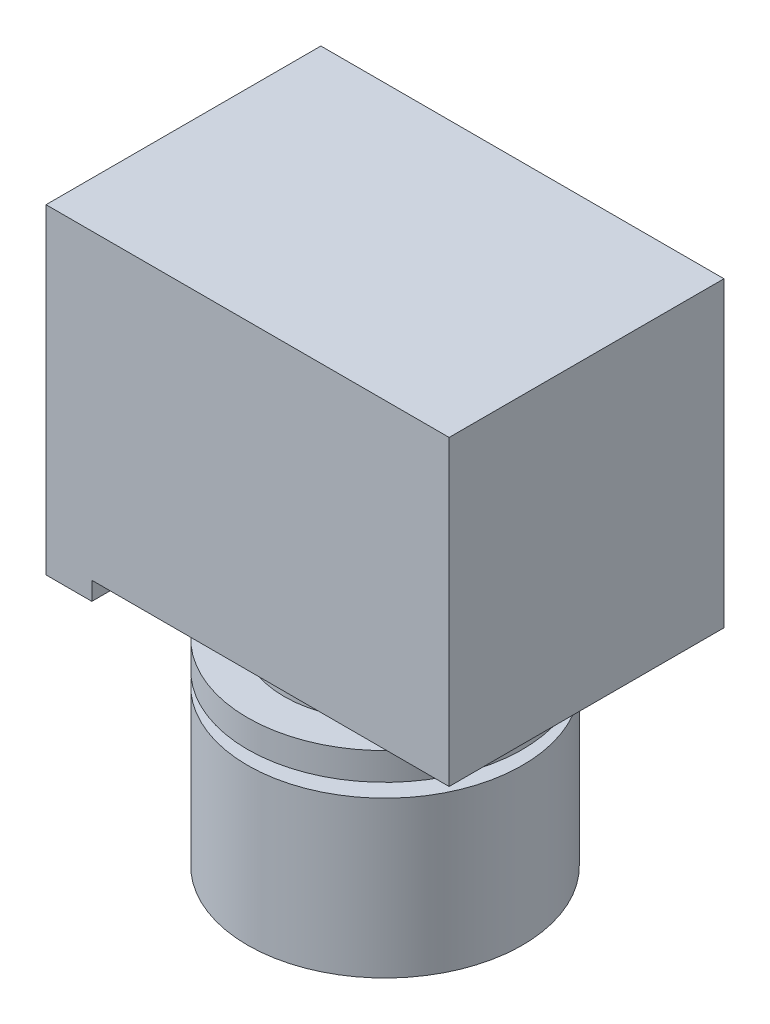
ISO-10303-21;
HEADER;
FILE_DESCRIPTION(('STEP AP214'),'2;1');
FILE_NAME('part.step','',(''),(''),'','','');
FILE_SCHEMA(('AUTOMOTIVE_DESIGN { 1 0 10303 214 1 1 1 1 }'));
ENDSEC;
DATA;
#1=APPLICATION_CONTEXT('core data for automotive mechanical design processes');
#2=APPLICATION_PROTOCOL_DEFINITION('international standard','automotive_design',2000,#1);
#3=PRODUCT_CONTEXT('',#1,'mechanical');
#4=PRODUCT('Part','Part','',(#3));
#5=PRODUCT_RELATED_PRODUCT_CATEGORY('part','',(#4));
#6=PRODUCT_DEFINITION_FORMATION('','',#4);
#7=PRODUCT_DEFINITION_CONTEXT('part definition',#1,'design');
#8=PRODUCT_DEFINITION('design','',#6,#7);
#9=PRODUCT_DEFINITION_SHAPE('','',#8);
#10=(LENGTH_UNIT() NAMED_UNIT(*) SI_UNIT(.MILLI.,.METRE.));
#11=(NAMED_UNIT(*) PLANE_ANGLE_UNIT() SI_UNIT($,.RADIAN.));
#12=(NAMED_UNIT(*) SI_UNIT($,.STERADIAN.) SOLID_ANGLE_UNIT());
#13=UNCERTAINTY_MEASURE_WITH_UNIT(LENGTH_MEASURE(1.E-05),#10,'distance_accuracy_value','');
#14=(GEOMETRIC_REPRESENTATION_CONTEXT(3) GLOBAL_UNCERTAINTY_ASSIGNED_CONTEXT((#13)) GLOBAL_UNIT_ASSIGNED_CONTEXT((#10,
#11,#12)) REPRESENTATION_CONTEXT('',''));
#15=CARTESIAN_POINT('',(0.,0.,0.));
#16=DIRECTION('',(0.,0.,1.));
#17=DIRECTION('',(1.,0.,0.));
#18=AXIS2_PLACEMENT_3D('',#15,#16,#17);
#19=CARTESIAN_POINT('',(-22.,26.,15.));
#20=DIRECTION('',(0.,1.,0.));
#21=DIRECTION('',(0.,0.,1.));
#22=AXIS2_PLACEMENT_3D('',#19,#20,#21);
#23=PLANE('',#22);
#24=CARTESIAN_POINT('',(0.,26.,0.));
#25=DIRECTION('',(0.,1.,0.));
#26=DIRECTION('',(0.,0.,1.));
#27=AXIS2_PLACEMENT_3D('',#24,#25,#26);
#28=CIRCLE('',#27,11.);
#29=CARTESIAN_POINT('',(0.,26.,11.));
#30=VERTEX_POINT('',#29);
#31=EDGE_CURVE('E123',#30,#30,#28,.T.);
#32=ORIENTED_EDGE('',*,*,#31,.T.);
#33=EDGE_LOOP('',(#32));
#34=FACE_BOUND('',#33,.T.);
#35=DIRECTION('',(0.,0.,1.));
#36=VECTOR('',#35,1.);
#37=CARTESIAN_POINT('',(-17.,26.,15.));
#38=LINE('',#37,#36);
#39=CARTESIAN_POINT('',(-17.,26.,-15.));
#40=VERTEX_POINT('',#39);
#41=CARTESIAN_POINT('',(-17.,26.,15.));
#42=VERTEX_POINT('',#41);
#43=EDGE_CURVE('E224',#40,#42,#38,.T.);
#44=ORIENTED_EDGE('',*,*,#43,.F.);
#45=DIRECTION('',(-1.,0.,0.));
#46=VECTOR('',#45,1.);
#47=CARTESIAN_POINT('',(-22.,26.,-15.));
#48=LINE('',#47,#46);
#49=CARTESIAN_POINT('',(22.,26.,-15.));
#50=VERTEX_POINT('',#49);
#51=EDGE_CURVE('E115',#50,#40,#48,.T.);
#52=ORIENTED_EDGE('',*,*,#51,.F.);
#53=DIRECTION('',(0.,0.,-1.));
#54=VECTOR('',#53,1.);
#55=CARTESIAN_POINT('',(22.,26.,-15.));
#56=LINE('',#55,#54);
#57=CARTESIAN_POINT('',(22.,26.,15.));
#58=VERTEX_POINT('',#57);
#59=EDGE_CURVE('E112',#58,#50,#56,.T.);
#60=ORIENTED_EDGE('',*,*,#59,.F.);
#61=DIRECTION('',(1.,0.,0.));
#62=VECTOR('',#61,1.);
#63=CARTESIAN_POINT('',(-22.,26.,15.));
#64=LINE('',#63,#62);
#65=EDGE_CURVE('E65',#42,#58,#64,.T.);
#66=ORIENTED_EDGE('',*,*,#65,.F.);
#67=EDGE_LOOP('',(#44,#52,#60,#66));
#68=FACE_BOUND('',#67,.T.);
#69=ADVANCED_FACE('F36',(#34,#68),#23,.F.);
#70=CARTESIAN_POINT('',(0.,21.5,0.));
#71=DIRECTION('',(0.,1.,0.));
#72=DIRECTION('',(0.,0.,1.));
#73=AXIS2_PLACEMENT_3D('',#70,#71,#72);
#74=PLANE('',#73);
#75=CARTESIAN_POINT('',(0.,21.5,0.));
#76=DIRECTION('',(0.,1.,0.));
#77=DIRECTION('',(0.,0.,1.));
#78=AXIS2_PLACEMENT_3D('',#75,#76,#77);
#79=CIRCLE('',#78,15.);
#80=CARTESIAN_POINT('',(0.,21.5,15.));
#81=VERTEX_POINT('',#80);
#82=EDGE_CURVE('E129',#81,#81,#79,.T.);
#83=ORIENTED_EDGE('',*,*,#82,.T.);
#84=EDGE_LOOP('',(#83));
#85=FACE_BOUND('',#84,.T.);
#86=CARTESIAN_POINT('',(0.,21.5,0.));
#87=DIRECTION('',(0.,1.,0.));
#88=DIRECTION('',(0.,0.,1.));
#89=AXIS2_PLACEMENT_3D('',#86,#87,#88);
#90=CIRCLE('',#89,11.);
#91=CARTESIAN_POINT('',(0.,21.5,11.));
#92=VERTEX_POINT('',#91);
#93=EDGE_CURVE('E122',#92,#92,#90,.T.);
#94=ORIENTED_EDGE('',*,*,#93,.F.);
#95=EDGE_LOOP('',(#94));
#96=FACE_BOUND('',#95,.T.);
#97=ADVANCED_FACE('F145',(#85,#96),#74,.T.);
#98=CARTESIAN_POINT('',(0.,17.,0.));
#99=DIRECTION('',(0.,1.,0.));
#100=DIRECTION('',(0.,0.,1.));
#101=AXIS2_PLACEMENT_3D('',#98,#99,#100);
#102=PLANE('',#101);
#103=CARTESIAN_POINT('',(0.,17.,0.));
#104=DIRECTION('',(0.,1.,0.));
#105=DIRECTION('',(0.,0.,1.));
#106=AXIS2_PLACEMENT_3D('',#103,#104,#105);
#107=CIRCLE('',#106,15.);
#108=CARTESIAN_POINT('',(0.,17.,15.));
#109=VERTEX_POINT('',#108);
#110=EDGE_CURVE('E11',#109,#109,#107,.T.);
#111=ORIENTED_EDGE('',*,*,#110,.T.);
#112=EDGE_LOOP('',(#111));
#113=FACE_BOUND('',#112,.T.);
#114=CARTESIAN_POINT('',(0.,17.,0.));
#115=DIRECTION('',(0.,1.,0.));
#116=DIRECTION('',(0.,0.,1.));
#117=AXIS2_PLACEMENT_3D('',#114,#115,#116);
#118=CIRCLE('',#117,11.);
#119=CARTESIAN_POINT('',(0.,17.,11.));
#120=VERTEX_POINT('',#119);
#121=EDGE_CURVE('E132',#120,#120,#118,.T.);
#122=ORIENTED_EDGE('',*,*,#121,.F.);
#123=EDGE_LOOP('',(#122));
#124=FACE_BOUND('',#123,.T.);
#125=ADVANCED_FACE('F143',(#113,#124),#102,.T.);
#126=CARTESIAN_POINT('',(0.,17.,0.));
#127=DIRECTION('',(0.,-1.,0.));
#128=DIRECTION('',(0.,0.,-1.));
#129=AXIS2_PLACEMENT_3D('',#126,#127,#128);
#130=CYLINDRICAL_SURFACE('',#129,15.);
#131=ORIENTED_EDGE('',*,*,#110,.F.);
#132=EDGE_LOOP('',(#131));
#133=FACE_BOUND('',#132,.T.);
#134=CARTESIAN_POINT('',(0.,0.,0.));
#135=DIRECTION('',(0.,1.,0.));
#136=DIRECTION('',(0.,0.,1.));
#137=AXIS2_PLACEMENT_3D('',#134,#135,#136);
#138=CIRCLE('',#137,15.);
#139=CARTESIAN_POINT('',(0.,0.,15.));
#140=VERTEX_POINT('',#139);
#141=EDGE_CURVE('E40',#140,#140,#138,.T.);
#142=ORIENTED_EDGE('',*,*,#141,.T.);
#143=EDGE_LOOP('',(#142));
#144=FACE_BOUND('',#143,.T.);
#145=ADVANCED_FACE('F38',(#133,#144),#130,.T.);
#146=CARTESIAN_POINT('',(0.,0.,0.));
#147=DIRECTION('',(0.,1.,0.));
#148=DIRECTION('',(0.,0.,1.));
#149=AXIS2_PLACEMENT_3D('',#146,#147,#148);
#150=PLANE('',#149);
#151=CARTESIAN_POINT('',(0.,0.,0.));
#152=DIRECTION('',(0.,-1.,0.));
#153=DIRECTION('',(0.,0.,-1.));
#154=AXIS2_PLACEMENT_3D('',#151,#152,#153);
#155=CIRCLE('',#154,13.);
#156=CARTESIAN_POINT('',(0.,0.,-13.));
#157=VERTEX_POINT('',#156);
#158=EDGE_CURVE('E218',#157,#157,#155,.T.);
#159=ORIENTED_EDGE('',*,*,#158,.F.);
#160=EDGE_LOOP('',(#159));
#161=FACE_BOUND('',#160,.T.);
#162=ORIENTED_EDGE('',*,*,#141,.F.);
#163=EDGE_LOOP('',(#162));
#164=FACE_BOUND('',#163,.T.);
#165=ADVANCED_FACE('F152',(#161,#164),#150,.F.);
#166=CARTESIAN_POINT('',(0.,18.5,0.));
#167=DIRECTION('',(0.,-1.,0.));
#168=DIRECTION('',(0.,0.,-1.));
#169=AXIS2_PLACEMENT_3D('',#166,#167,#168);
#170=CYLINDRICAL_SURFACE('',#169,11.);
#171=CARTESIAN_POINT('',(0.,18.5,0.));
#172=DIRECTION('',(0.,1.,0.));
#173=DIRECTION('',(0.,0.,1.));
#174=AXIS2_PLACEMENT_3D('',#171,#172,#173);
#175=CIRCLE('',#174,11.);
#176=CARTESIAN_POINT('',(0.,18.5,11.));
#177=VERTEX_POINT('',#176);
#178=EDGE_CURVE('E135',#177,#177,#175,.T.);
#179=ORIENTED_EDGE('',*,*,#178,.F.);
#180=EDGE_LOOP('',(#179));
#181=FACE_BOUND('',#180,.T.);
#182=ORIENTED_EDGE('',*,*,#121,.T.);
#183=EDGE_LOOP('',(#182));
#184=FACE_BOUND('',#183,.T.);
#185=ADVANCED_FACE('F141',(#181,#184),#170,.T.);
#186=CARTESIAN_POINT('',(0.,18.5,0.));
#187=DIRECTION('',(0.,1.,0.));
#188=DIRECTION('',(0.,0.,1.));
#189=AXIS2_PLACEMENT_3D('',#186,#187,#188);
#190=PLANE('',#189);
#191=CARTESIAN_POINT('',(0.,18.5,0.));
#192=DIRECTION('',(0.,1.,0.));
#193=DIRECTION('',(0.,0.,1.));
#194=AXIS2_PLACEMENT_3D('',#191,#192,#193);
#195=CIRCLE('',#194,15.);
#196=CARTESIAN_POINT('',(0.,18.5,15.));
#197=VERTEX_POINT('',#196);
#198=EDGE_CURVE('E126',#197,#197,#195,.T.);
#199=ORIENTED_EDGE('',*,*,#198,.F.);
#200=EDGE_LOOP('',(#199));
#201=FACE_BOUND('',#200,.T.);
#202=ORIENTED_EDGE('',*,*,#178,.T.);
#203=EDGE_LOOP('',(#202));
#204=FACE_BOUND('',#203,.T.);
#205=ADVANCED_FACE('F183',(#201,#204),#190,.F.);
#206=CARTESIAN_POINT('',(0.,21.5,0.));
#207=DIRECTION('',(0.,-1.,0.));
#208=DIRECTION('',(0.,0.,-1.));
#209=AXIS2_PLACEMENT_3D('',#206,#207,#208);
#210=CYLINDRICAL_SURFACE('',#209,15.);
#211=ORIENTED_EDGE('',*,*,#82,.F.);
#212=EDGE_LOOP('',(#211));
#213=FACE_BOUND('',#212,.T.);
#214=ORIENTED_EDGE('',*,*,#198,.T.);
#215=EDGE_LOOP('',(#214));
#216=FACE_BOUND('',#215,.T.);
#217=ADVANCED_FACE('F180',(#213,#216),#210,.T.);
#218=CARTESIAN_POINT('',(0.,26.,0.));
#219=DIRECTION('',(0.,-1.,0.));
#220=DIRECTION('',(0.,0.,-1.));
#221=AXIS2_PLACEMENT_3D('',#218,#219,#220);
#222=CYLINDRICAL_SURFACE('',#221,11.);
#223=ORIENTED_EDGE('',*,*,#31,.F.);
#224=EDGE_LOOP('',(#223));
#225=FACE_BOUND('',#224,.T.);
#226=ORIENTED_EDGE('',*,*,#93,.T.);
#227=EDGE_LOOP('',(#226));
#228=FACE_BOUND('',#227,.T.);
#229=ADVANCED_FACE('F177',(#225,#228),#222,.T.);
#230=CARTESIAN_POINT('',(-22.,59.,-15.));
#231=DIRECTION('',(1.,0.,0.));
#232=DIRECTION('',(0.,0.,-1.));
#233=AXIS2_PLACEMENT_3D('',#230,#231,#232);
#234=PLANE('',#233);
#235=DIRECTION('',(0.,-1.,0.));
#236=VECTOR('',#235,1.);
#237=CARTESIAN_POINT('',(-22.,59.,-15.));
#238=LINE('',#237,#236);
#239=CARTESIAN_POINT('',(-22.,59.,-15.));
#240=VERTEX_POINT('',#239);
#241=CARTESIAN_POINT('',(-22.,24.,-15.));
#242=VERTEX_POINT('',#241);
#243=EDGE_CURVE('E107',#240,#242,#238,.T.);
#244=ORIENTED_EDGE('',*,*,#243,.T.);
#245=DIRECTION('',(0.,0.,-1.));
#246=VECTOR('',#245,1.);
#247=CARTESIAN_POINT('',(-22.,24.,15.));
#248=LINE('',#247,#246);
#249=CARTESIAN_POINT('',(-22.,24.,15.));
#250=VERTEX_POINT('',#249);
#251=EDGE_CURVE('E227',#250,#242,#248,.T.);
#252=ORIENTED_EDGE('',*,*,#251,.F.);
#253=DIRECTION('',(0.,-1.,0.));
#254=VECTOR('',#253,1.);
#255=CARTESIAN_POINT('',(-22.,59.,15.));
#256=LINE('',#255,#254);
#257=CARTESIAN_POINT('',(-22.,59.,15.));
#258=VERTEX_POINT('',#257);
#259=EDGE_CURVE('E75',#258,#250,#256,.T.);
#260=ORIENTED_EDGE('',*,*,#259,.F.);
#261=DIRECTION('',(0.,0.,1.));
#262=VECTOR('',#261,1.);
#263=CARTESIAN_POINT('',(-22.,59.,-15.));
#264=LINE('',#263,#262);
#265=EDGE_CURVE('E96',#240,#258,#264,.T.);
#266=ORIENTED_EDGE('',*,*,#265,.F.);
#267=EDGE_LOOP('',(#244,#252,#260,#266));
#268=FACE_BOUND('',#267,.T.);
#269=ADVANCED_FACE('F174',(#268),#234,.F.);
#270=CARTESIAN_POINT('',(-22.,59.,15.));
#271=DIRECTION('',(0.,0.,-1.));
#272=DIRECTION('',(-1.,0.,0.));
#273=AXIS2_PLACEMENT_3D('',#270,#271,#272);
#274=PLANE('',#273);
#275=ORIENTED_EDGE('',*,*,#259,.T.);
#276=DIRECTION('',(-1.,0.,0.));
#277=VECTOR('',#276,1.);
#278=CARTESIAN_POINT('',(-22.,24.,15.));
#279=LINE('',#278,#277);
#280=CARTESIAN_POINT('',(-17.,24.,15.));
#281=VERTEX_POINT('',#280);
#282=EDGE_CURVE('E235',#281,#250,#279,.T.);
#283=ORIENTED_EDGE('',*,*,#282,.F.);
#284=DIRECTION('',(0.,1.,0.));
#285=VECTOR('',#284,1.);
#286=CARTESIAN_POINT('',(-17.,24.,15.));
#287=LINE('',#286,#285);
#288=EDGE_CURVE('E237',#281,#42,#287,.T.);
#289=ORIENTED_EDGE('',*,*,#288,.T.);
#290=ORIENTED_EDGE('',*,*,#65,.T.);
#291=DIRECTION('',(0.,-1.,0.));
#292=VECTOR('',#291,1.);
#293=CARTESIAN_POINT('',(22.,59.,15.));
#294=LINE('',#293,#292);
#295=CARTESIAN_POINT('',(22.,59.,15.));
#296=VERTEX_POINT('',#295);
#297=EDGE_CURVE('E98',#296,#58,#294,.T.);
#298=ORIENTED_EDGE('',*,*,#297,.F.);
#299=DIRECTION('',(1.,0.,0.));
#300=VECTOR('',#299,1.);
#301=CARTESIAN_POINT('',(-22.,59.,15.));
#302=LINE('',#301,#300);
#303=EDGE_CURVE('E90',#258,#296,#302,.T.);
#304=ORIENTED_EDGE('',*,*,#303,.F.);
#305=EDGE_LOOP('',(#275,#283,#289,#290,#298,#304));
#306=FACE_BOUND('',#305,.T.);
#307=ADVANCED_FACE('F99',(#306),#274,.F.);
#308=CARTESIAN_POINT('',(22.,59.,-15.));
#309=DIRECTION('',(-1.,0.,0.));
#310=DIRECTION('',(0.,0.,1.));
#311=AXIS2_PLACEMENT_3D('',#308,#309,#310);
#312=PLANE('',#311);
#313=ORIENTED_EDGE('',*,*,#59,.T.);
#314=DIRECTION('',(0.,-1.,0.));
#315=VECTOR('',#314,1.);
#316=CARTESIAN_POINT('',(22.,59.,-15.));
#317=LINE('',#316,#315);
#318=CARTESIAN_POINT('',(22.,59.,-15.));
#319=VERTEX_POINT('',#318);
#320=EDGE_CURVE('E102',#319,#50,#317,.T.);
#321=ORIENTED_EDGE('',*,*,#320,.F.);
#322=DIRECTION('',(0.,0.,-1.));
#323=VECTOR('',#322,1.);
#324=CARTESIAN_POINT('',(22.,59.,-15.));
#325=LINE('',#324,#323);
#326=EDGE_CURVE('E93',#296,#319,#325,.T.);
#327=ORIENTED_EDGE('',*,*,#326,.F.);
#328=ORIENTED_EDGE('',*,*,#297,.T.);
#329=EDGE_LOOP('',(#313,#321,#327,#328));
#330=FACE_BOUND('',#329,.T.);
#331=ADVANCED_FACE('F104',(#330),#312,.F.);
#332=CARTESIAN_POINT('',(-22.,59.,-15.));
#333=DIRECTION('',(0.,0.,1.));
#334=DIRECTION('',(1.,0.,0.));
#335=AXIS2_PLACEMENT_3D('',#332,#333,#334);
#336=PLANE('',#335);
#337=ORIENTED_EDGE('',*,*,#51,.T.);
#338=DIRECTION('',(0.,1.,0.));
#339=VECTOR('',#338,1.);
#340=CARTESIAN_POINT('',(-17.,24.,-15.));
#341=LINE('',#340,#339);
#342=CARTESIAN_POINT('',(-17.,24.,-15.));
#343=VERTEX_POINT('',#342);
#344=EDGE_CURVE('E113',#343,#40,#341,.T.);
#345=ORIENTED_EDGE('',*,*,#344,.F.);
#346=DIRECTION('',(1.,0.,0.));
#347=VECTOR('',#346,1.);
#348=CARTESIAN_POINT('',(-22.,24.,-15.));
#349=LINE('',#348,#347);
#350=EDGE_CURVE('E230',#242,#343,#349,.T.);
#351=ORIENTED_EDGE('',*,*,#350,.F.);
#352=ORIENTED_EDGE('',*,*,#243,.F.);
#353=DIRECTION('',(-1.,0.,0.));
#354=VECTOR('',#353,1.);
#355=CARTESIAN_POINT('',(-22.,59.,-15.));
#356=LINE('',#355,#354);
#357=EDGE_CURVE('E53',#319,#240,#356,.T.);
#358=ORIENTED_EDGE('',*,*,#357,.F.);
#359=ORIENTED_EDGE('',*,*,#320,.T.);
#360=EDGE_LOOP('',(#337,#345,#351,#352,#358,#359));
#361=FACE_BOUND('',#360,.T.);
#362=ADVANCED_FACE('F166',(#361),#336,.F.);
#363=CARTESIAN_POINT('',(-22.,59.,15.));
#364=DIRECTION('',(0.,1.,0.));
#365=DIRECTION('',(0.,0.,1.));
#366=AXIS2_PLACEMENT_3D('',#363,#364,#365);
#367=PLANE('',#366);
#368=ORIENTED_EDGE('',*,*,#265,.T.);
#369=ORIENTED_EDGE('',*,*,#303,.T.);
#370=ORIENTED_EDGE('',*,*,#326,.T.);
#371=ORIENTED_EDGE('',*,*,#357,.T.);
#372=EDGE_LOOP('',(#368,#369,#370,#371));
#373=FACE_BOUND('',#372,.T.);
#374=ADVANCED_FACE('F91',(#373),#367,.T.);
#375=CARTESIAN_POINT('',(-17.,24.,15.));
#376=DIRECTION('',(-1.,0.,0.));
#377=DIRECTION('',(0.,0.,1.));
#378=AXIS2_PLACEMENT_3D('',#375,#376,#377);
#379=PLANE('',#378);
#380=ORIENTED_EDGE('',*,*,#43,.T.);
#381=ORIENTED_EDGE('',*,*,#288,.F.);
#382=DIRECTION('',(0.,0.,1.));
#383=VECTOR('',#382,1.);
#384=CARTESIAN_POINT('',(-17.,24.,15.));
#385=LINE('',#384,#383);
#386=EDGE_CURVE('E233',#343,#281,#385,.T.);
#387=ORIENTED_EDGE('',*,*,#386,.F.);
#388=ORIENTED_EDGE('',*,*,#344,.T.);
#389=EDGE_LOOP('',(#380,#381,#387,#388));
#390=FACE_BOUND('',#389,.T.);
#391=ADVANCED_FACE('F244',(#390),#379,.F.);
#392=CARTESIAN_POINT('',(-22.,24.,-15.));
#393=DIRECTION('',(0.,-1.,0.));
#394=DIRECTION('',(0.,0.,-1.));
#395=AXIS2_PLACEMENT_3D('',#392,#393,#394);
#396=PLANE('',#395);
#397=ORIENTED_EDGE('',*,*,#251,.T.);
#398=ORIENTED_EDGE('',*,*,#350,.T.);
#399=ORIENTED_EDGE('',*,*,#386,.T.);
#400=ORIENTED_EDGE('',*,*,#282,.T.);
#401=EDGE_LOOP('',(#397,#398,#399,#400));
#402=FACE_BOUND('',#401,.T.);
#403=ADVANCED_FACE('F250',(#402),#396,.T.);
#404=CARTESIAN_POINT('',(0.,2.,0.));
#405=DIRECTION('',(0.,-1.,0.));
#406=DIRECTION('',(0.,0.,-1.));
#407=AXIS2_PLACEMENT_3D('',#404,#405,#406);
#408=CYLINDRICAL_SURFACE('',#407,13.);
#409=CARTESIAN_POINT('',(0.,2.,0.));
#410=DIRECTION('',(0.,-1.,0.));
#411=DIRECTION('',(0.,0.,-1.));
#412=AXIS2_PLACEMENT_3D('',#409,#410,#411);
#413=CIRCLE('',#412,13.);
#414=CARTESIAN_POINT('',(0.,2.,-13.));
#415=VERTEX_POINT('',#414);
#416=EDGE_CURVE('E221',#415,#415,#413,.T.);
#417=ORIENTED_EDGE('',*,*,#416,.F.);
#418=EDGE_LOOP('',(#417));
#419=FACE_BOUND('',#418,.T.);
#420=ORIENTED_EDGE('',*,*,#158,.T.);
#421=EDGE_LOOP('',(#420));
#422=FACE_BOUND('',#421,.T.);
#423=ADVANCED_FACE('F253',(#419,#422),#408,.F.);
#424=CARTESIAN_POINT('',(0.,2.,0.));
#425=DIRECTION('',(0.,-1.,0.));
#426=DIRECTION('',(0.,0.,-1.));
#427=AXIS2_PLACEMENT_3D('',#424,#425,#426);
#428=PLANE('',#427);
#429=CARTESIAN_POINT('',(0.,2.,0.));
#430=DIRECTION('',(0.,-1.,0.));
#431=DIRECTION('',(0.,0.,-1.));
#432=AXIS2_PLACEMENT_3D('',#429,#430,#431);
#433=CIRCLE('',#432,12.);
#434=CARTESIAN_POINT('',(0.,2.,-12.));
#435=VERTEX_POINT('',#434);
#436=EDGE_CURVE('E215',#435,#435,#433,.T.);
#437=ORIENTED_EDGE('',*,*,#436,.F.);
#438=EDGE_LOOP('',(#437));
#439=FACE_BOUND('',#438,.T.);
#440=ORIENTED_EDGE('',*,*,#416,.T.);
#441=EDGE_LOOP('',(#440));
#442=FACE_BOUND('',#441,.T.);
#443=ADVANCED_FACE('F208',(#439,#442),#428,.T.);
#444=CARTESIAN_POINT('',(0.,2.,0.));
#445=DIRECTION('',(0.,-1.,0.));
#446=DIRECTION('',(0.,0.,-1.));
#447=AXIS2_PLACEMENT_3D('',#444,#445,#446);
#448=CYLINDRICAL_SURFACE('',#447,12.);
#449=ORIENTED_EDGE('',*,*,#436,.T.);
#450=EDGE_LOOP('',(#449));
#451=FACE_BOUND('',#450,.T.);
#452=CARTESIAN_POINT('',(0.,0.,0.));
#453=DIRECTION('',(0.,-1.,0.));
#454=DIRECTION('',(0.,0.,-1.));
#455=AXIS2_PLACEMENT_3D('',#452,#453,#454);
#456=CIRCLE('',#455,12.);
#457=CARTESIAN_POINT('',(0.,0.,-12.));
#458=VERTEX_POINT('',#457);
#459=EDGE_CURVE('E213',#458,#458,#456,.T.);
#460=ORIENTED_EDGE('',*,*,#459,.F.);
#461=EDGE_LOOP('',(#460));
#462=FACE_BOUND('',#461,.T.);
#463=ADVANCED_FACE('F203',(#451,#462),#448,.T.);
#464=ORIENTED_EDGE('',*,*,#459,.T.);
#465=EDGE_LOOP('',(#464));
#466=FACE_BOUND('',#465,.T.);
#467=ADVANCED_FACE('F195',(#466),#150,.F.);
#468=CLOSED_SHELL('',(#69,#97,#125,#145,#165,#185,#205,#217,#229,#269,#307,#331,#362,#374,#391,
#403,#423,#443,#463,#467));
#469=MANIFOLD_SOLID_BREP('B2',#468);
#470=ADVANCED_BREP_SHAPE_REPRESENTATION('',(#18,#469),#14);
#471=SHAPE_DEFINITION_REPRESENTATION(#9,#470);
ENDSEC;
END-ISO-10303-21;
